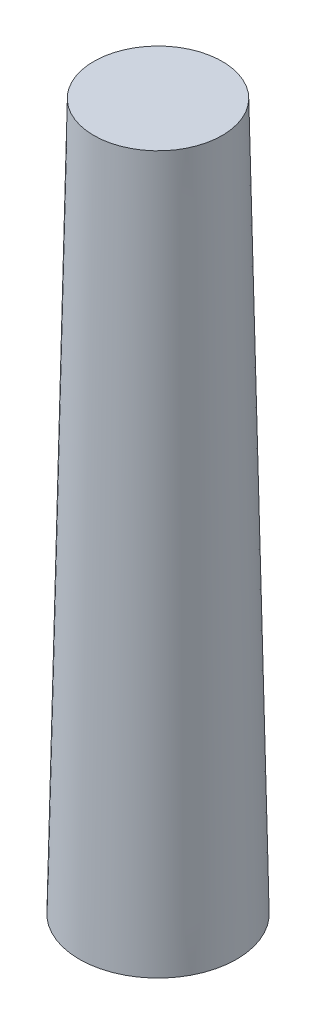
ISO-10303-21;
HEADER;
FILE_DESCRIPTION(('STEP AP214'),'2;1');
FILE_NAME('part.step','',(''),(''),'','','');
FILE_SCHEMA(('AUTOMOTIVE_DESIGN { 1 0 10303 214 1 1 1 1 }'));
ENDSEC;
DATA;
#1=APPLICATION_CONTEXT('core data for automotive mechanical design processes');
#2=APPLICATION_PROTOCOL_DEFINITION('international standard','automotive_design',2000,#1);
#3=PRODUCT_CONTEXT('',#1,'mechanical');
#4=PRODUCT('Part','Part','',(#3));
#5=PRODUCT_RELATED_PRODUCT_CATEGORY('part','',(#4));
#6=PRODUCT_DEFINITION_FORMATION('','',#4);
#7=PRODUCT_DEFINITION_CONTEXT('part definition',#1,'design');
#8=PRODUCT_DEFINITION('design','',#6,#7);
#9=PRODUCT_DEFINITION_SHAPE('','',#8);
#10=(LENGTH_UNIT() NAMED_UNIT(*) SI_UNIT(.MILLI.,.METRE.));
#11=(NAMED_UNIT(*) PLANE_ANGLE_UNIT() SI_UNIT($,.RADIAN.));
#12=(NAMED_UNIT(*) SI_UNIT($,.STERADIAN.) SOLID_ANGLE_UNIT());
#13=UNCERTAINTY_MEASURE_WITH_UNIT(LENGTH_MEASURE(1.E-05),#10,'distance_accuracy_value','');
#14=(GEOMETRIC_REPRESENTATION_CONTEXT(3) GLOBAL_UNCERTAINTY_ASSIGNED_CONTEXT((#13)) GLOBAL_UNIT_ASSIGNED_CONTEXT((#10,
#11,#12)) REPRESENTATION_CONTEXT('',''));
#15=CARTESIAN_POINT('',(0.,0.,0.));
#16=DIRECTION('',(0.,0.,1.));
#17=DIRECTION('',(1.,0.,0.));
#18=AXIS2_PLACEMENT_3D('',#15,#16,#17);
#19=CARTESIAN_POINT('',(0.,0.,0.));
#20=DIRECTION('',(0.,1.,0.));
#21=DIRECTION('',(0.,0.,1.));
#22=AXIS2_PLACEMENT_3D('',#19,#20,#21);
#23=PLANE('',#22);
#24=CARTESIAN_POINT('',(0.,0.,0.));
#25=DIRECTION('',(0.,1.,0.));
#26=DIRECTION('',(0.,0.,1.));
#27=AXIS2_PLACEMENT_3D('',#24,#25,#26);
#28=CIRCLE('',#27,1.8669);
#29=CARTESIAN_POINT('',(0.,0.,1.8669));
#30=VERTEX_POINT('',#29);
#31=EDGE_CURVE('E45',#30,#30,#28,.T.);
#32=ORIENTED_EDGE('',*,*,#31,.F.);
#33=EDGE_LOOP('',(#32));
#34=FACE_BOUND('',#33,.T.);
#35=ADVANCED_FACE('F37',(#34),#23,.F.);
#36=CARTESIAN_POINT('',(0.,16.764,0.));
#37=DIRECTION('',(0.,1.,0.));
#38=DIRECTION('',(0.,0.,1.));
#39=AXIS2_PLACEMENT_3D('',#36,#37,#38);
#40=PLANE('',#39);
#41=CARTESIAN_POINT('',(0.,16.764,0.));
#42=DIRECTION('',(0.,1.,0.));
#43=DIRECTION('',(0.,0.,1.));
#44=AXIS2_PLACEMENT_3D('',#41,#42,#43);
#45=CIRCLE('',#44,1.524);
#46=CARTESIAN_POINT('',(0.,16.764,1.524));
#47=VERTEX_POINT('',#46);
#48=EDGE_CURVE('E11',#47,#47,#45,.T.);
#49=ORIENTED_EDGE('',*,*,#48,.T.);
#50=EDGE_LOOP('',(#49));
#51=FACE_BOUND('',#50,.T.);
#52=ADVANCED_FACE('F85',(#51),#40,.T.);
#53=CARTESIAN_POINT('',(0.,16.764,0.));
#54=DIRECTION('',(0.,-1.,0.));
#55=DIRECTION('',(0.,0.,-1.));
#56=AXIS2_PLACEMENT_3D('',#53,#54,#55);
#57=CONICAL_SURFACE('',#56,1.524,0.0204516935220559);
#58=ORIENTED_EDGE('',*,*,#48,.F.);
#59=EDGE_LOOP('',(#58));
#60=FACE_BOUND('',#59,.T.);
#61=ORIENTED_EDGE('',*,*,#31,.T.);
#62=EDGE_LOOP('',(#61));
#63=FACE_BOUND('',#62,.T.);
#64=ADVANCED_FACE('F70',(#60,#63),#57,.T.);
#65=CLOSED_SHELL('',(#35,#52,#64));
#66=MANIFOLD_SOLID_BREP('B2',#65);
#67=ADVANCED_BREP_SHAPE_REPRESENTATION('',(#18,#66),#14);
#68=SHAPE_DEFINITION_REPRESENTATION(#9,#67);
ENDSEC;
END-ISO-10303-21;
